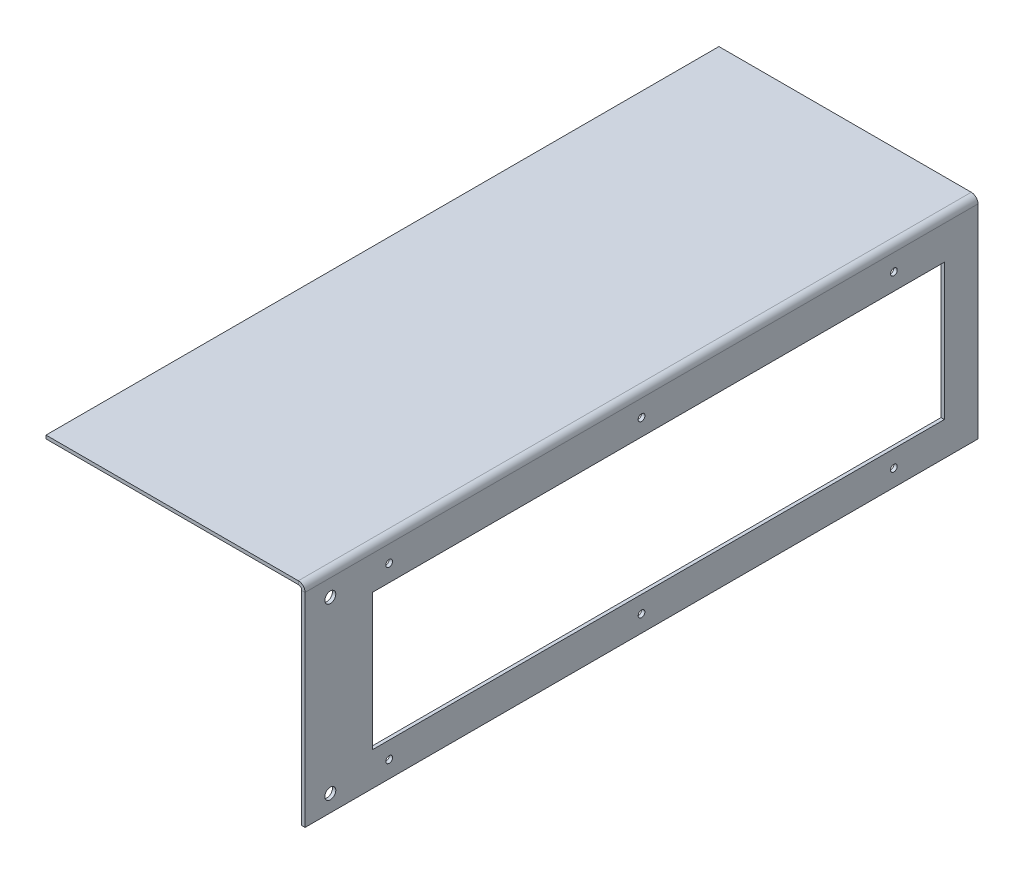
ISO-10303-21;
HEADER;
FILE_DESCRIPTION(('STEP AP214'),'2;1');
FILE_NAME('part.step','',(''),(''),'','','');
FILE_SCHEMA(('AUTOMOTIVE_DESIGN { 1 0 10303 214 1 1 1 1 }'));
ENDSEC;
DATA;
#1=APPLICATION_CONTEXT('core data for automotive mechanical design processes');
#2=APPLICATION_PROTOCOL_DEFINITION('international standard','automotive_design',2000,#1);
#3=PRODUCT_CONTEXT('',#1,'mechanical');
#4=PRODUCT('Part','Part','',(#3));
#5=PRODUCT_RELATED_PRODUCT_CATEGORY('part','',(#4));
#6=PRODUCT_DEFINITION_FORMATION('','',#4);
#7=PRODUCT_DEFINITION_CONTEXT('part definition',#1,'design');
#8=PRODUCT_DEFINITION('design','',#6,#7);
#9=PRODUCT_DEFINITION_SHAPE('','',#8);
#10=(LENGTH_UNIT() NAMED_UNIT(*) SI_UNIT(.MILLI.,.METRE.));
#11=(NAMED_UNIT(*) PLANE_ANGLE_UNIT() SI_UNIT($,.RADIAN.));
#12=(NAMED_UNIT(*) SI_UNIT($,.STERADIAN.) SOLID_ANGLE_UNIT());
#13=UNCERTAINTY_MEASURE_WITH_UNIT(LENGTH_MEASURE(1.E-05),#10,'distance_accuracy_value','');
#14=(GEOMETRIC_REPRESENTATION_CONTEXT(3) GLOBAL_UNCERTAINTY_ASSIGNED_CONTEXT((#13)) GLOBAL_UNIT_ASSIGNED_CONTEXT((#10,
#11,#12)) REPRESENTATION_CONTEXT('',''));
#15=CARTESIAN_POINT('',(0.,0.,0.));
#16=DIRECTION('',(0.,0.,1.));
#17=DIRECTION('',(1.,0.,0.));
#18=AXIS2_PLACEMENT_3D('',#15,#16,#17);
#19=CARTESIAN_POINT('',(79.,-24.0000000000001,360.));
#20=DIRECTION('',(0.,0.,-1.));
#21=DIRECTION('',(0.,-1.,0.));
#22=AXIS2_PLACEMENT_3D('',#19,#20,#21);
#23=PLANE('',#22);
#24=DIRECTION('',(1.,0.,0.));
#25=VECTOR('',#24,1.);
#26=CARTESIAN_POINT('',(79.,-105.,360.));
#27=LINE('',#26,#25);
#28=CARTESIAN_POINT('',(77.,-105.,360.));
#29=VERTEX_POINT('',#28);
#30=CARTESIAN_POINT('',(79.,-105.,360.));
#31=VERTEX_POINT('',#30);
#32=EDGE_CURVE('E11',#29,#31,#27,.T.);
#33=ORIENTED_EDGE('',*,*,#32,.F.);
#34=DIRECTION('',(0.,-1.,0.));
#35=VECTOR('',#34,1.);
#36=CARTESIAN_POINT('',(77.,-4.00000000000001,360.));
#37=LINE('',#36,#35);
#38=CARTESIAN_POINT('',(77.,-24.0000000000001,360.));
#39=VERTEX_POINT('',#38);
#40=EDGE_CURVE('E122',#39,#29,#37,.T.);
#41=ORIENTED_EDGE('',*,*,#40,.F.);
#42=DIRECTION('',(1.,0.,0.));
#43=VECTOR('',#42,1.);
#44=CARTESIAN_POINT('',(79.,-24.0000000000001,360.));
#45=LINE('',#44,#43);
#46=CARTESIAN_POINT('',(79.,-24.0000000000001,360.));
#47=VERTEX_POINT('',#46);
#48=EDGE_CURVE('E49',#39,#47,#45,.T.);
#49=ORIENTED_EDGE('',*,*,#48,.T.);
#50=DIRECTION('',(0.,-1.,0.));
#51=VECTOR('',#50,1.);
#52=CARTESIAN_POINT('',(79.,-24.0000000000001,360.));
#53=LINE('',#52,#51);
#54=EDGE_CURVE('E163',#47,#31,#53,.T.);
#55=ORIENTED_EDGE('',*,*,#54,.T.);
#56=EDGE_LOOP('',(#33,#41,#49,#55));
#57=FACE_BOUND('',#56,.T.);
#58=ADVANCED_FACE('F39',(#57),#23,.T.);
#59=CARTESIAN_POINT('',(79.,-24.,20.));
#60=DIRECTION('',(0.,-1.,0.));
#61=DIRECTION('',(0.,0.,1.));
#62=AXIS2_PLACEMENT_3D('',#59,#60,#61);
#63=PLANE('',#62);
#64=ORIENTED_EDGE('',*,*,#48,.F.);
#65=DIRECTION('',(0.,0.,1.));
#66=VECTOR('',#65,1.);
#67=CARTESIAN_POINT('',(77.,-24.,400.));
#68=LINE('',#67,#66);
#69=CARTESIAN_POINT('',(77.,-24.,20.));
#70=VERTEX_POINT('',#69);
#71=EDGE_CURVE('E133',#70,#39,#68,.T.);
#72=ORIENTED_EDGE('',*,*,#71,.F.);
#73=DIRECTION('',(1.,0.,0.));
#74=VECTOR('',#73,1.);
#75=CARTESIAN_POINT('',(79.,-24.,20.));
#76=LINE('',#75,#74);
#77=CARTESIAN_POINT('',(79.,-24.,20.));
#78=VERTEX_POINT('',#77);
#79=EDGE_CURVE('E113',#70,#78,#76,.T.);
#80=ORIENTED_EDGE('',*,*,#79,.T.);
#81=DIRECTION('',(0.,0.,1.));
#82=VECTOR('',#81,1.);
#83=CARTESIAN_POINT('',(79.,-24.,20.));
#84=LINE('',#83,#82);
#85=EDGE_CURVE('E172',#78,#47,#84,.T.);
#86=ORIENTED_EDGE('',*,*,#85,.T.);
#87=EDGE_LOOP('',(#64,#72,#80,#86));
#88=FACE_BOUND('',#87,.T.);
#89=ADVANCED_FACE('F174',(#88),#63,.T.);
#90=CARTESIAN_POINT('',(79.,-24.,20.));
#91=DIRECTION('',(0.,0.,1.));
#92=DIRECTION('',(0.,1.,0.));
#93=AXIS2_PLACEMENT_3D('',#90,#91,#92);
#94=PLANE('',#93);
#95=ORIENTED_EDGE('',*,*,#79,.F.);
#96=DIRECTION('',(0.,-1.,0.));
#97=VECTOR('',#96,1.);
#98=CARTESIAN_POINT('',(77.,-4.00000000000001,20.));
#99=LINE('',#98,#97);
#100=CARTESIAN_POINT('',(77.,-105.,20.));
#101=VERTEX_POINT('',#100);
#102=EDGE_CURVE('E120',#101,#70,#99,.F.);
#103=ORIENTED_EDGE('',*,*,#102,.F.);
#104=DIRECTION('',(1.,0.,0.));
#105=VECTOR('',#104,1.);
#106=CARTESIAN_POINT('',(79.,-105.,20.));
#107=LINE('',#106,#105);
#108=CARTESIAN_POINT('',(79.,-105.,20.));
#109=VERTEX_POINT('',#108);
#110=EDGE_CURVE('E43',#101,#109,#107,.T.);
#111=ORIENTED_EDGE('',*,*,#110,.T.);
#112=DIRECTION('',(0.,1.,0.));
#113=VECTOR('',#112,1.);
#114=CARTESIAN_POINT('',(79.,-24.,20.));
#115=LINE('',#114,#113);
#116=EDGE_CURVE('E414',#109,#78,#115,.T.);
#117=ORIENTED_EDGE('',*,*,#116,.T.);
#118=EDGE_LOOP('',(#95,#103,#111,#117));
#119=FACE_BOUND('',#118,.T.);
#120=ADVANCED_FACE('F124',(#119),#94,.T.);
#121=CARTESIAN_POINT('',(-75.,0.,400.));
#122=DIRECTION('',(-1.,0.,0.));
#123=DIRECTION('',(0.,0.,-1.));
#124=AXIS2_PLACEMENT_3D('',#121,#122,#123);
#125=PLANE('',#124);
#126=DIRECTION('',(0.,1.,0.));
#127=VECTOR('',#126,1.);
#128=CARTESIAN_POINT('',(-75.,0.,0.));
#129=LINE('',#128,#127);
#130=CARTESIAN_POINT('',(-75.,-1.99999999999999,0.));
#131=VERTEX_POINT('',#130);
#132=CARTESIAN_POINT('',(-75.,0.,0.));
#133=VERTEX_POINT('',#132);
#134=EDGE_CURVE('E114',#131,#133,#129,.T.);
#135=ORIENTED_EDGE('',*,*,#134,.F.);
#136=DIRECTION('',(0.,0.,1.));
#137=VECTOR('',#136,1.);
#138=CARTESIAN_POINT('',(-75.,-1.99999999999999,400.));
#139=LINE('',#138,#137);
#140=CARTESIAN_POINT('',(-75.,-1.99999999999999,400.));
#141=VERTEX_POINT('',#140);
#142=EDGE_CURVE('E218',#141,#131,#139,.F.);
#143=ORIENTED_EDGE('',*,*,#142,.F.);
#144=DIRECTION('',(0.,1.,0.));
#145=VECTOR('',#144,1.);
#146=CARTESIAN_POINT('',(-75.,0.,400.));
#147=LINE('',#146,#145);
#148=CARTESIAN_POINT('',(-75.,0.,400.));
#149=VERTEX_POINT('',#148);
#150=EDGE_CURVE('E150',#141,#149,#147,.T.);
#151=ORIENTED_EDGE('',*,*,#150,.T.);
#152=DIRECTION('',(0.,0.,-1.));
#153=VECTOR('',#152,1.);
#154=CARTESIAN_POINT('',(-75.,0.,400.));
#155=LINE('',#154,#153);
#156=EDGE_CURVE('E385',#149,#133,#155,.T.);
#157=ORIENTED_EDGE('',*,*,#156,.T.);
#158=EDGE_LOOP('',(#135,#143,#151,#157));
#159=FACE_BOUND('',#158,.T.);
#160=ADVANCED_FACE('F268',(#159),#125,.T.);
#161=CARTESIAN_POINT('',(-75.,0.,400.));
#162=DIRECTION('',(0.,0.,1.));
#163=DIRECTION('',(-1.,0.,0.));
#164=AXIS2_PLACEMENT_3D('',#161,#162,#163);
#165=PLANE('',#164);
#166=ORIENTED_EDGE('',*,*,#150,.F.);
#167=DIRECTION('',(1.,0.,0.));
#168=VECTOR('',#167,1.);
#169=CARTESIAN_POINT('',(-75.,-1.99999999999999,400.));
#170=LINE('',#169,#168);
#171=CARTESIAN_POINT('',(75.,-1.99999999999999,400.));
#172=VERTEX_POINT('',#171);
#173=EDGE_CURVE('E198',#172,#141,#170,.F.);
#174=ORIENTED_EDGE('',*,*,#173,.F.);
#175=DIRECTION('',(0.,1.,0.));
#176=VECTOR('',#175,1.);
#177=CARTESIAN_POINT('',(75.,0.,400.));
#178=LINE('',#177,#176);
#179=CARTESIAN_POINT('',(75.,0.,400.));
#180=VERTEX_POINT('',#179);
#181=EDGE_CURVE('E147',#172,#180,#178,.T.);
#182=ORIENTED_EDGE('',*,*,#181,.T.);
#183=DIRECTION('',(-1.,0.,0.));
#184=VECTOR('',#183,1.);
#185=CARTESIAN_POINT('',(-75.,0.,400.));
#186=LINE('',#185,#184);
#187=EDGE_CURVE('E388',#180,#149,#186,.T.);
#188=ORIENTED_EDGE('',*,*,#187,.T.);
#189=EDGE_LOOP('',(#166,#174,#182,#188));
#190=FACE_BOUND('',#189,.T.);
#191=ADVANCED_FACE('F272',(#190),#165,.T.);
#192=CARTESIAN_POINT('',(75.,-4.00000000000001,400.));
#193=DIRECTION('',(0.,0.,-1.));
#194=DIRECTION('',(-1.,0.,0.));
#195=AXIS2_PLACEMENT_3D('',#192,#193,#194);
#196=PLANE('',#195);
#197=ORIENTED_EDGE('',*,*,#181,.F.);
#198=CARTESIAN_POINT('',(75.,-4.00000000000001,400.));
#199=DIRECTION('',(0.,0.,-1.));
#200=DIRECTION('',(-1.,0.,0.));
#201=AXIS2_PLACEMENT_3D('',#198,#199,#200);
#202=CIRCLE('',#201,2.00000000000002);
#203=CARTESIAN_POINT('',(77.,-4.00000000000001,400.));
#204=VERTEX_POINT('',#203);
#205=EDGE_CURVE('E206',#204,#172,#202,.F.);
#206=ORIENTED_EDGE('',*,*,#205,.F.);
#207=DIRECTION('',(1.,0.,0.));
#208=VECTOR('',#207,1.);
#209=CARTESIAN_POINT('',(79.,-4.00000000000001,400.));
#210=LINE('',#209,#208);
#211=CARTESIAN_POINT('',(79.,-4.00000000000001,400.));
#212=VERTEX_POINT('',#211);
#213=EDGE_CURVE('E144',#204,#212,#210,.T.);
#214=ORIENTED_EDGE('',*,*,#213,.T.);
#215=CARTESIAN_POINT('',(75.,-4.00000000000001,400.));
#216=DIRECTION('',(0.,0.,1.));
#217=DIRECTION('',(1.,0.,0.));
#218=AXIS2_PLACEMENT_3D('',#215,#216,#217);
#219=CIRCLE('',#218,4.00000000000002);
#220=EDGE_CURVE('E157',#212,#180,#219,.T.);
#221=ORIENTED_EDGE('',*,*,#220,.T.);
#222=EDGE_LOOP('',(#197,#206,#214,#221));
#223=FACE_BOUND('',#222,.T.);
#224=ADVANCED_FACE('F278',(#223),#196,.F.);
#225=CARTESIAN_POINT('',(79.,-4.00000000000001,400.));
#226=DIRECTION('',(0.,0.,1.));
#227=DIRECTION('',(0.,1.,0.));
#228=AXIS2_PLACEMENT_3D('',#225,#226,#227);
#229=PLANE('',#228);
#230=ORIENTED_EDGE('',*,*,#213,.F.);
#231=DIRECTION('',(0.,-1.,0.));
#232=VECTOR('',#231,1.);
#233=CARTESIAN_POINT('',(77.,-4.00000000000001,400.));
#234=LINE('',#233,#232);
#235=CARTESIAN_POINT('',(77.,-125.,400.));
#236=VERTEX_POINT('',#235);
#237=EDGE_CURVE('E202',#236,#204,#234,.F.);
#238=ORIENTED_EDGE('',*,*,#237,.F.);
#239=DIRECTION('',(1.,0.,0.));
#240=VECTOR('',#239,1.);
#241=CARTESIAN_POINT('',(79.,-125.,400.));
#242=LINE('',#241,#240);
#243=CARTESIAN_POINT('',(79.,-125.,400.));
#244=VERTEX_POINT('',#243);
#245=EDGE_CURVE('E142',#236,#244,#242,.T.);
#246=ORIENTED_EDGE('',*,*,#245,.T.);
#247=DIRECTION('',(0.,1.,0.));
#248=VECTOR('',#247,1.);
#249=CARTESIAN_POINT('',(79.,-4.00000000000001,400.));
#250=LINE('',#249,#248);
#251=EDGE_CURVE('E184',#244,#212,#250,.T.);
#252=ORIENTED_EDGE('',*,*,#251,.T.);
#253=EDGE_LOOP('',(#230,#238,#246,#252));
#254=FACE_BOUND('',#253,.T.);
#255=ADVANCED_FACE('F345',(#254),#229,.T.);
#256=CARTESIAN_POINT('',(79.,-125.,400.));
#257=DIRECTION('',(0.,1.,0.));
#258=DIRECTION('',(0.,0.,-1.));
#259=AXIS2_PLACEMENT_3D('',#256,#257,#258);
#260=PLANE('',#259);
#261=ORIENTED_EDGE('',*,*,#245,.F.);
#262=DIRECTION('',(0.,0.,1.));
#263=VECTOR('',#262,1.);
#264=CARTESIAN_POINT('',(77.,-125.,400.));
#265=LINE('',#264,#263);
#266=CARTESIAN_POINT('',(77.,-125.,0.));
#267=VERTEX_POINT('',#266);
#268=EDGE_CURVE('E207',#236,#267,#265,.F.);
#269=ORIENTED_EDGE('',*,*,#268,.T.);
#270=DIRECTION('',(1.,0.,0.));
#271=VECTOR('',#270,1.);
#272=CARTESIAN_POINT('',(79.,-125.,0.));
#273=LINE('',#272,#271);
#274=CARTESIAN_POINT('',(79.,-125.,0.));
#275=VERTEX_POINT('',#274);
#276=EDGE_CURVE('E57',#267,#275,#273,.T.);
#277=ORIENTED_EDGE('',*,*,#276,.T.);
#278=DIRECTION('',(0.,0.,-1.));
#279=VECTOR('',#278,1.);
#280=CARTESIAN_POINT('',(79.,-125.,400.));
#281=LINE('',#280,#279);
#282=EDGE_CURVE('E187',#244,#275,#281,.T.);
#283=ORIENTED_EDGE('',*,*,#282,.F.);
#284=EDGE_LOOP('',(#261,#269,#277,#283));
#285=FACE_BOUND('',#284,.T.);
#286=ADVANCED_FACE('F341',(#285),#260,.F.);
#287=CARTESIAN_POINT('',(79.,-4.00000000000001,0.));
#288=DIRECTION('',(0.,0.,1.));
#289=DIRECTION('',(0.,1.,0.));
#290=AXIS2_PLACEMENT_3D('',#287,#288,#289);
#291=PLANE('',#290);
#292=ORIENTED_EDGE('',*,*,#276,.F.);
#293=DIRECTION('',(0.,-1.,0.));
#294=VECTOR('',#293,1.);
#295=CARTESIAN_POINT('',(77.,-4.00000000000001,0.));
#296=LINE('',#295,#294);
#297=CARTESIAN_POINT('',(77.,-4.00000000000001,0.));
#298=VERTEX_POINT('',#297);
#299=EDGE_CURVE('E135',#267,#298,#296,.F.);
#300=ORIENTED_EDGE('',*,*,#299,.T.);
#301=DIRECTION('',(1.,0.,0.));
#302=VECTOR('',#301,1.);
#303=CARTESIAN_POINT('',(79.,-4.00000000000001,0.));
#304=LINE('',#303,#302);
#305=CARTESIAN_POINT('',(79.,-4.00000000000001,0.));
#306=VERTEX_POINT('',#305);
#307=EDGE_CURVE('E137',#298,#306,#304,.T.);
#308=ORIENTED_EDGE('',*,*,#307,.T.);
#309=DIRECTION('',(0.,1.,0.));
#310=VECTOR('',#309,1.);
#311=CARTESIAN_POINT('',(79.,-4.00000000000001,0.));
#312=LINE('',#311,#310);
#313=EDGE_CURVE('E175',#275,#306,#312,.T.);
#314=ORIENTED_EDGE('',*,*,#313,.F.);
#315=EDGE_LOOP('',(#292,#300,#308,#314));
#316=FACE_BOUND('',#315,.T.);
#317=ADVANCED_FACE('F337',(#316),#291,.F.);
#318=CARTESIAN_POINT('',(75.,-4.00000000000001,0.));
#319=DIRECTION('',(0.,0.,-1.));
#320=DIRECTION('',(-1.,0.,0.));
#321=AXIS2_PLACEMENT_3D('',#318,#319,#320);
#322=PLANE('',#321);
#323=ORIENTED_EDGE('',*,*,#307,.F.);
#324=CARTESIAN_POINT('',(75.,-4.00000000000001,0.));
#325=DIRECTION('',(0.,0.,-1.));
#326=DIRECTION('',(-1.,0.,0.));
#327=AXIS2_PLACEMENT_3D('',#324,#325,#326);
#328=CIRCLE('',#327,2.00000000000002);
#329=CARTESIAN_POINT('',(75.,-2.,0.));
#330=VERTEX_POINT('',#329);
#331=EDGE_CURVE('E203',#298,#330,#328,.F.);
#332=ORIENTED_EDGE('',*,*,#331,.T.);
#333=DIRECTION('',(0.,1.,0.));
#334=VECTOR('',#333,1.);
#335=CARTESIAN_POINT('',(75.,0.,0.));
#336=LINE('',#335,#334);
#337=CARTESIAN_POINT('',(75.,0.,0.));
#338=VERTEX_POINT('',#337);
#339=EDGE_CURVE('E140',#330,#338,#336,.T.);
#340=ORIENTED_EDGE('',*,*,#339,.T.);
#341=CARTESIAN_POINT('',(75.,-4.00000000000001,0.));
#342=DIRECTION('',(0.,0.,1.));
#343=DIRECTION('',(1.,0.,0.));
#344=AXIS2_PLACEMENT_3D('',#341,#342,#343);
#345=CIRCLE('',#344,4.00000000000002);
#346=EDGE_CURVE('E189',#306,#338,#345,.T.);
#347=ORIENTED_EDGE('',*,*,#346,.F.);
#348=EDGE_LOOP('',(#323,#332,#340,#347));
#349=FACE_BOUND('',#348,.T.);
#350=ADVANCED_FACE('F292',(#349),#322,.T.);
#351=CARTESIAN_POINT('',(79.,-14.,50.));
#352=DIRECTION('',(-1.,0.,0.));
#353=DIRECTION('',(0.,-1.,0.));
#354=AXIS2_PLACEMENT_3D('',#351,#352,#353);
#355=CYLINDRICAL_SURFACE('',#354,2.);
#356=CARTESIAN_POINT('',(79.,-14.,50.));
#357=DIRECTION('',(1.,0.,0.));
#358=DIRECTION('',(0.,-1.,0.));
#359=AXIS2_PLACEMENT_3D('',#356,#357,#358);
#360=CIRCLE('',#359,2.);
#361=CARTESIAN_POINT('',(79.,-16.,50.));
#362=VERTEX_POINT('',#361);
#363=EDGE_CURVE('E393',#362,#362,#360,.T.);
#364=ORIENTED_EDGE('',*,*,#363,.T.);
#365=EDGE_LOOP('',(#364));
#366=FACE_BOUND('',#365,.T.);
#367=CARTESIAN_POINT('',(77.,-14.,50.));
#368=DIRECTION('',(1.,0.,0.));
#369=DIRECTION('',(0.,1.,0.));
#370=AXIS2_PLACEMENT_3D('',#367,#368,#369);
#371=CIRCLE('',#370,2.);
#372=CARTESIAN_POINT('',(77.,-12.,50.));
#373=VERTEX_POINT('',#372);
#374=EDGE_CURVE('E197',#373,#373,#371,.T.);
#375=ORIENTED_EDGE('',*,*,#374,.F.);
#376=EDGE_LOOP('',(#375));
#377=FACE_BOUND('',#376,.T.);
#378=ADVANCED_FACE('F288',(#366,#377),#355,.F.);
#379=CARTESIAN_POINT('',(79.,-14.,200.));
#380=DIRECTION('',(-1.,0.,0.));
#381=DIRECTION('',(0.,-1.,0.));
#382=AXIS2_PLACEMENT_3D('',#379,#380,#381);
#383=CYLINDRICAL_SURFACE('',#382,2.);
#384=CARTESIAN_POINT('',(79.,-14.,200.));
#385=DIRECTION('',(1.,0.,0.));
#386=DIRECTION('',(0.,-1.,0.));
#387=AXIS2_PLACEMENT_3D('',#384,#385,#386);
#388=CIRCLE('',#387,2.);
#389=CARTESIAN_POINT('',(79.,-16.,200.));
#390=VERTEX_POINT('',#389);
#391=EDGE_CURVE('E396',#390,#390,#388,.T.);
#392=ORIENTED_EDGE('',*,*,#391,.T.);
#393=EDGE_LOOP('',(#392));
#394=FACE_BOUND('',#393,.T.);
#395=CARTESIAN_POINT('',(77.,-14.,200.));
#396=DIRECTION('',(1.,0.,0.));
#397=DIRECTION('',(0.,1.,0.));
#398=AXIS2_PLACEMENT_3D('',#395,#396,#397);
#399=CIRCLE('',#398,2.);
#400=CARTESIAN_POINT('',(77.,-12.,200.));
#401=VERTEX_POINT('',#400);
#402=EDGE_CURVE('E226',#401,#401,#399,.T.);
#403=ORIENTED_EDGE('',*,*,#402,.F.);
#404=EDGE_LOOP('',(#403));
#405=FACE_BOUND('',#404,.T.);
#406=ADVANCED_FACE('F291',(#394,#405),#383,.F.);
#407=CARTESIAN_POINT('',(79.,-14.,350.));
#408=DIRECTION('',(-1.,0.,0.));
#409=DIRECTION('',(0.,-1.,0.));
#410=AXIS2_PLACEMENT_3D('',#407,#408,#409);
#411=CYLINDRICAL_SURFACE('',#410,2.);
#412=CARTESIAN_POINT('',(79.,-14.,350.));
#413=DIRECTION('',(1.,0.,0.));
#414=DIRECTION('',(0.,-1.,0.));
#415=AXIS2_PLACEMENT_3D('',#412,#413,#414);
#416=CIRCLE('',#415,2.);
#417=CARTESIAN_POINT('',(79.,-16.,350.));
#418=VERTEX_POINT('',#417);
#419=EDGE_CURVE('E399',#418,#418,#416,.T.);
#420=ORIENTED_EDGE('',*,*,#419,.T.);
#421=EDGE_LOOP('',(#420));
#422=FACE_BOUND('',#421,.T.);
#423=CARTESIAN_POINT('',(77.,-14.,350.));
#424=DIRECTION('',(1.,0.,0.));
#425=DIRECTION('',(0.,1.,0.));
#426=AXIS2_PLACEMENT_3D('',#423,#424,#425);
#427=CIRCLE('',#426,2.);
#428=CARTESIAN_POINT('',(77.,-12.,350.));
#429=VERTEX_POINT('',#428);
#430=EDGE_CURVE('E229',#429,#429,#427,.T.);
#431=ORIENTED_EDGE('',*,*,#430,.F.);
#432=EDGE_LOOP('',(#431));
#433=FACE_BOUND('',#432,.T.);
#434=ADVANCED_FACE('F296',(#422,#433),#411,.F.);
#435=CARTESIAN_POINT('',(79.,-115.,350.));
#436=DIRECTION('',(-1.,0.,0.));
#437=DIRECTION('',(0.,-1.,0.));
#438=AXIS2_PLACEMENT_3D('',#435,#436,#437);
#439=CYLINDRICAL_SURFACE('',#438,2.);
#440=CARTESIAN_POINT('',(79.,-115.,350.));
#441=DIRECTION('',(1.,0.,0.));
#442=DIRECTION('',(0.,1.,0.));
#443=AXIS2_PLACEMENT_3D('',#440,#441,#442);
#444=CIRCLE('',#443,2.);
#445=CARTESIAN_POINT('',(79.,-113.,350.));
#446=VERTEX_POINT('',#445);
#447=EDGE_CURVE('E402',#446,#446,#444,.T.);
#448=ORIENTED_EDGE('',*,*,#447,.T.);
#449=EDGE_LOOP('',(#448));
#450=FACE_BOUND('',#449,.T.);
#451=CARTESIAN_POINT('',(77.,-115.,350.));
#452=DIRECTION('',(1.,0.,0.));
#453=DIRECTION('',(0.,1.,0.));
#454=AXIS2_PLACEMENT_3D('',#451,#452,#453);
#455=CIRCLE('',#454,2.);
#456=CARTESIAN_POINT('',(77.,-113.,350.));
#457=VERTEX_POINT('',#456);
#458=EDGE_CURVE('E232',#457,#457,#455,.T.);
#459=ORIENTED_EDGE('',*,*,#458,.F.);
#460=EDGE_LOOP('',(#459));
#461=FACE_BOUND('',#460,.T.);
#462=ADVANCED_FACE('F300',(#450,#461),#439,.F.);
#463=CARTESIAN_POINT('',(79.,-115.,200.));
#464=DIRECTION('',(-1.,0.,0.));
#465=DIRECTION('',(0.,-1.,0.));
#466=AXIS2_PLACEMENT_3D('',#463,#464,#465);
#467=CYLINDRICAL_SURFACE('',#466,2.);
#468=CARTESIAN_POINT('',(79.,-115.,200.));
#469=DIRECTION('',(1.,0.,0.));
#470=DIRECTION('',(0.,1.,0.));
#471=AXIS2_PLACEMENT_3D('',#468,#469,#470);
#472=CIRCLE('',#471,2.);
#473=CARTESIAN_POINT('',(79.,-113.,200.));
#474=VERTEX_POINT('',#473);
#475=EDGE_CURVE('E312',#474,#474,#472,.T.);
#476=ORIENTED_EDGE('',*,*,#475,.T.);
#477=EDGE_LOOP('',(#476));
#478=FACE_BOUND('',#477,.T.);
#479=CARTESIAN_POINT('',(77.,-115.,200.));
#480=DIRECTION('',(1.,0.,0.));
#481=DIRECTION('',(0.,1.,0.));
#482=AXIS2_PLACEMENT_3D('',#479,#480,#481);
#483=CIRCLE('',#482,2.);
#484=CARTESIAN_POINT('',(77.,-113.,200.));
#485=VERTEX_POINT('',#484);
#486=EDGE_CURVE('E235',#485,#485,#483,.T.);
#487=ORIENTED_EDGE('',*,*,#486,.F.);
#488=EDGE_LOOP('',(#487));
#489=FACE_BOUND('',#488,.T.);
#490=ADVANCED_FACE('F257',(#478,#489),#467,.F.);
#491=CARTESIAN_POINT('',(79.,-115.,50.));
#492=DIRECTION('',(-1.,0.,0.));
#493=DIRECTION('',(0.,-1.,0.));
#494=AXIS2_PLACEMENT_3D('',#491,#492,#493);
#495=CYLINDRICAL_SURFACE('',#494,2.);
#496=CARTESIAN_POINT('',(79.,-115.,50.));
#497=DIRECTION('',(1.,0.,0.));
#498=DIRECTION('',(0.,1.,0.));
#499=AXIS2_PLACEMENT_3D('',#496,#497,#498);
#500=CIRCLE('',#499,2.);
#501=CARTESIAN_POINT('',(79.,-113.,50.));
#502=VERTEX_POINT('',#501);
#503=EDGE_CURVE('E406',#502,#502,#500,.T.);
#504=ORIENTED_EDGE('',*,*,#503,.T.);
#505=EDGE_LOOP('',(#504));
#506=FACE_BOUND('',#505,.T.);
#507=CARTESIAN_POINT('',(77.,-115.,50.));
#508=DIRECTION('',(1.,0.,0.));
#509=DIRECTION('',(0.,1.,0.));
#510=AXIS2_PLACEMENT_3D('',#507,#508,#509);
#511=CIRCLE('',#510,2.);
#512=CARTESIAN_POINT('',(77.,-113.,50.));
#513=VERTEX_POINT('',#512);
#514=EDGE_CURVE('E238',#513,#513,#511,.T.);
#515=ORIENTED_EDGE('',*,*,#514,.F.);
#516=EDGE_LOOP('',(#515));
#517=FACE_BOUND('',#516,.T.);
#518=ADVANCED_FACE('F248',(#506,#517),#495,.F.);
#519=CARTESIAN_POINT('',(79.,-14.,385.));
#520=DIRECTION('',(-1.,0.,0.));
#521=DIRECTION('',(0.,-1.,0.));
#522=AXIS2_PLACEMENT_3D('',#519,#520,#521);
#523=CYLINDRICAL_SURFACE('',#522,3.24999999999995);
#524=CARTESIAN_POINT('',(79.,-14.,385.));
#525=DIRECTION('',(1.,0.,0.));
#526=DIRECTION('',(0.,1.,0.));
#527=AXIS2_PLACEMENT_3D('',#524,#525,#526);
#528=CIRCLE('',#527,3.24999999999995);
#529=CARTESIAN_POINT('',(79.,-10.7500000000001,385.));
#530=VERTEX_POINT('',#529);
#531=EDGE_CURVE('E409',#530,#530,#528,.T.);
#532=ORIENTED_EDGE('',*,*,#531,.T.);
#533=EDGE_LOOP('',(#532));
#534=FACE_BOUND('',#533,.T.);
#535=CARTESIAN_POINT('',(77.,-14.,385.));
#536=DIRECTION('',(1.,0.,0.));
#537=DIRECTION('',(0.,1.,0.));
#538=AXIS2_PLACEMENT_3D('',#535,#536,#537);
#539=CIRCLE('',#538,3.24999999999995);
#540=CARTESIAN_POINT('',(77.,-10.7500000000001,385.));
#541=VERTEX_POINT('',#540);
#542=EDGE_CURVE('E129',#541,#541,#539,.T.);
#543=ORIENTED_EDGE('',*,*,#542,.F.);
#544=EDGE_LOOP('',(#543));
#545=FACE_BOUND('',#544,.T.);
#546=ADVANCED_FACE('F245',(#534,#545),#523,.F.);
#547=CARTESIAN_POINT('',(79.,-115.,385.));
#548=DIRECTION('',(-1.,0.,0.));
#549=DIRECTION('',(0.,-1.,0.));
#550=AXIS2_PLACEMENT_3D('',#547,#548,#549);
#551=CYLINDRICAL_SURFACE('',#550,3.24999999999995);
#552=CARTESIAN_POINT('',(79.,-115.,385.));
#553=DIRECTION('',(1.,0.,0.));
#554=DIRECTION('',(0.,1.,0.));
#555=AXIS2_PLACEMENT_3D('',#552,#553,#554);
#556=CIRCLE('',#555,3.24999999999995);
#557=CARTESIAN_POINT('',(79.,-111.75,385.));
#558=VERTEX_POINT('',#557);
#559=EDGE_CURVE('E411',#558,#558,#556,.T.);
#560=ORIENTED_EDGE('',*,*,#559,.T.);
#561=EDGE_LOOP('',(#560));
#562=FACE_BOUND('',#561,.T.);
#563=CARTESIAN_POINT('',(77.,-115.,385.));
#564=DIRECTION('',(1.,0.,0.));
#565=DIRECTION('',(0.,1.,0.));
#566=AXIS2_PLACEMENT_3D('',#563,#564,#565);
#567=CIRCLE('',#566,3.24999999999995);
#568=CARTESIAN_POINT('',(77.,-111.75,385.));
#569=VERTEX_POINT('',#568);
#570=EDGE_CURVE('E126',#569,#569,#567,.T.);
#571=ORIENTED_EDGE('',*,*,#570,.F.);
#572=EDGE_LOOP('',(#571));
#573=FACE_BOUND('',#572,.T.);
#574=ADVANCED_FACE('F247',(#562,#573),#551,.F.);
#575=CARTESIAN_POINT('',(79.,-105.,360.));
#576=DIRECTION('',(0.,1.,0.));
#577=DIRECTION('',(0.,0.,-1.));
#578=AXIS2_PLACEMENT_3D('',#575,#576,#577);
#579=PLANE('',#578);
#580=DIRECTION('',(0.,0.,1.));
#581=VECTOR('',#580,1.);
#582=CARTESIAN_POINT('',(77.,-105.,400.));
#583=LINE('',#582,#581);
#584=EDGE_CURVE('E105',#29,#101,#583,.F.);
#585=ORIENTED_EDGE('',*,*,#584,.F.);
#586=ORIENTED_EDGE('',*,*,#32,.T.);
#587=DIRECTION('',(0.,0.,-1.));
#588=VECTOR('',#587,1.);
#589=CARTESIAN_POINT('',(79.,-105.,360.));
#590=LINE('',#589,#588);
#591=EDGE_CURVE('E108',#31,#109,#590,.T.);
#592=ORIENTED_EDGE('',*,*,#591,.T.);
#593=ORIENTED_EDGE('',*,*,#110,.F.);
#594=EDGE_LOOP('',(#585,#586,#592,#593));
#595=FACE_BOUND('',#594,.T.);
#596=ADVANCED_FACE('F41',(#595),#579,.T.);
#597=CARTESIAN_POINT('',(-75.,0.,0.));
#598=DIRECTION('',(0.,0.,1.));
#599=DIRECTION('',(-1.,0.,0.));
#600=AXIS2_PLACEMENT_3D('',#597,#598,#599);
#601=PLANE('',#600);
#602=DIRECTION('',(1.,0.,0.));
#603=VECTOR('',#602,1.);
#604=CARTESIAN_POINT('',(-75.,-1.99999999999999,0.));
#605=LINE('',#604,#603);
#606=EDGE_CURVE('E221',#330,#131,#605,.F.);
#607=ORIENTED_EDGE('',*,*,#606,.T.);
#608=ORIENTED_EDGE('',*,*,#134,.T.);
#609=DIRECTION('',(-1.,0.,0.));
#610=VECTOR('',#609,1.);
#611=CARTESIAN_POINT('',(-75.,0.,0.));
#612=LINE('',#611,#610);
#613=EDGE_CURVE('E215',#338,#133,#612,.T.);
#614=ORIENTED_EDGE('',*,*,#613,.F.);
#615=ORIENTED_EDGE('',*,*,#339,.F.);
#616=EDGE_LOOP('',(#607,#608,#614,#615));
#617=FACE_BOUND('',#616,.T.);
#618=ADVANCED_FACE('F283',(#617),#601,.F.);
#619=CARTESIAN_POINT('',(75.,-4.00000000000001,400.));
#620=DIRECTION('',(0.,0.,-1.));
#621=DIRECTION('',(-1.,0.,0.));
#622=AXIS2_PLACEMENT_3D('',#619,#620,#621);
#623=CYLINDRICAL_SURFACE('',#622,4.00000000000002);
#624=ORIENTED_EDGE('',*,*,#346,.T.);
#625=DIRECTION('',(0.,0.,-1.));
#626=VECTOR('',#625,1.);
#627=CARTESIAN_POINT('',(75.,0.,400.));
#628=LINE('',#627,#626);
#629=EDGE_CURVE('E386',#180,#338,#628,.T.);
#630=ORIENTED_EDGE('',*,*,#629,.F.);
#631=ORIENTED_EDGE('',*,*,#220,.F.);
#632=DIRECTION('',(0.,0.,-1.));
#633=VECTOR('',#632,1.);
#634=CARTESIAN_POINT('',(79.,-4.00000000000001,400.));
#635=LINE('',#634,#633);
#636=EDGE_CURVE('E178',#212,#306,#635,.T.);
#637=ORIENTED_EDGE('',*,*,#636,.T.);
#638=EDGE_LOOP('',(#624,#630,#631,#637));
#639=FACE_BOUND('',#638,.T.);
#640=ADVANCED_FACE('F286',(#639),#623,.T.);
#641=CARTESIAN_POINT('',(79.,-4.00000000000001,400.));
#642=DIRECTION('',(-1.,0.,0.));
#643=DIRECTION('',(0.,-1.,0.));
#644=AXIS2_PLACEMENT_3D('',#641,#642,#643);
#645=PLANE('',#644);
#646=ORIENTED_EDGE('',*,*,#363,.F.);
#647=EDGE_LOOP('',(#646));
#648=FACE_BOUND('',#647,.T.);
#649=ORIENTED_EDGE('',*,*,#391,.F.);
#650=EDGE_LOOP('',(#649));
#651=FACE_BOUND('',#650,.T.);
#652=ORIENTED_EDGE('',*,*,#419,.F.);
#653=EDGE_LOOP('',(#652));
#654=FACE_BOUND('',#653,.T.);
#655=ORIENTED_EDGE('',*,*,#447,.F.);
#656=EDGE_LOOP('',(#655));
#657=FACE_BOUND('',#656,.T.);
#658=ORIENTED_EDGE('',*,*,#475,.F.);
#659=EDGE_LOOP('',(#658));
#660=FACE_BOUND('',#659,.T.);
#661=ORIENTED_EDGE('',*,*,#503,.F.);
#662=EDGE_LOOP('',(#661));
#663=FACE_BOUND('',#662,.T.);
#664=ORIENTED_EDGE('',*,*,#531,.F.);
#665=EDGE_LOOP('',(#664));
#666=FACE_BOUND('',#665,.T.);
#667=ORIENTED_EDGE('',*,*,#559,.F.);
#668=EDGE_LOOP('',(#667));
#669=FACE_BOUND('',#668,.T.);
#670=ORIENTED_EDGE('',*,*,#116,.F.);
#671=ORIENTED_EDGE('',*,*,#591,.F.);
#672=ORIENTED_EDGE('',*,*,#54,.F.);
#673=ORIENTED_EDGE('',*,*,#85,.F.);
#674=EDGE_LOOP('',(#670,#671,#672,#673));
#675=FACE_BOUND('',#674,.T.);
#676=ORIENTED_EDGE('',*,*,#313,.T.);
#677=ORIENTED_EDGE('',*,*,#636,.F.);
#678=ORIENTED_EDGE('',*,*,#251,.F.);
#679=ORIENTED_EDGE('',*,*,#282,.T.);
#680=EDGE_LOOP('',(#676,#677,#678,#679));
#681=FACE_BOUND('',#680,.T.);
#682=ADVANCED_FACE('F170',(#648,#651,#654,#657,#660,#663,#666,#669,#675,#681),#645,.F.);
#683=CARTESIAN_POINT('',(-75.,0.,400.));
#684=DIRECTION('',(0.,-1.,0.));
#685=DIRECTION('',(1.,0.,0.));
#686=AXIS2_PLACEMENT_3D('',#683,#684,#685);
#687=PLANE('',#686);
#688=ORIENTED_EDGE('',*,*,#613,.T.);
#689=ORIENTED_EDGE('',*,*,#156,.F.);
#690=ORIENTED_EDGE('',*,*,#187,.F.);
#691=ORIENTED_EDGE('',*,*,#629,.T.);
#692=EDGE_LOOP('',(#688,#689,#690,#691));
#693=FACE_BOUND('',#692,.T.);
#694=ADVANCED_FACE('F329',(#693),#687,.F.);
#695=CARTESIAN_POINT('',(75.,-4.00000000000001,400.));
#696=DIRECTION('',(0.,0.,-1.));
#697=DIRECTION('',(-1.,0.,0.));
#698=AXIS2_PLACEMENT_3D('',#695,#696,#697);
#699=CYLINDRICAL_SURFACE('',#698,2.00000000000002);
#700=ORIENTED_EDGE('',*,*,#331,.F.);
#701=DIRECTION('',(0.,0.,-1.));
#702=VECTOR('',#701,1.);
#703=CARTESIAN_POINT('',(77.,-4.00000000000001,400.));
#704=LINE('',#703,#702);
#705=EDGE_CURVE('E199',#204,#298,#704,.T.);
#706=ORIENTED_EDGE('',*,*,#705,.F.);
#707=ORIENTED_EDGE('',*,*,#205,.T.);
#708=DIRECTION('',(0.,0.,1.));
#709=VECTOR('',#708,1.);
#710=CARTESIAN_POINT('',(75.,-1.99999999999999,400.));
#711=LINE('',#710,#709);
#712=EDGE_CURVE('E194',#172,#330,#711,.F.);
#713=ORIENTED_EDGE('',*,*,#712,.T.);
#714=EDGE_LOOP('',(#700,#706,#707,#713));
#715=FACE_BOUND('',#714,.T.);
#716=ADVANCED_FACE('F318',(#715),#699,.F.);
#717=CARTESIAN_POINT('',(77.,-4.00000000000001,400.));
#718=DIRECTION('',(-1.,0.,0.));
#719=DIRECTION('',(0.,-1.,0.));
#720=AXIS2_PLACEMENT_3D('',#717,#718,#719);
#721=PLANE('',#720);
#722=ORIENTED_EDGE('',*,*,#374,.T.);
#723=EDGE_LOOP('',(#722));
#724=FACE_BOUND('',#723,.T.);
#725=ORIENTED_EDGE('',*,*,#402,.T.);
#726=EDGE_LOOP('',(#725));
#727=FACE_BOUND('',#726,.T.);
#728=ORIENTED_EDGE('',*,*,#430,.T.);
#729=EDGE_LOOP('',(#728));
#730=FACE_BOUND('',#729,.T.);
#731=ORIENTED_EDGE('',*,*,#458,.T.);
#732=EDGE_LOOP('',(#731));
#733=FACE_BOUND('',#732,.T.);
#734=ORIENTED_EDGE('',*,*,#486,.T.);
#735=EDGE_LOOP('',(#734));
#736=FACE_BOUND('',#735,.T.);
#737=ORIENTED_EDGE('',*,*,#514,.T.);
#738=EDGE_LOOP('',(#737));
#739=FACE_BOUND('',#738,.T.);
#740=ORIENTED_EDGE('',*,*,#542,.T.);
#741=EDGE_LOOP('',(#740));
#742=FACE_BOUND('',#741,.T.);
#743=ORIENTED_EDGE('',*,*,#570,.T.);
#744=EDGE_LOOP('',(#743));
#745=FACE_BOUND('',#744,.T.);
#746=ORIENTED_EDGE('',*,*,#102,.T.);
#747=ORIENTED_EDGE('',*,*,#71,.T.);
#748=ORIENTED_EDGE('',*,*,#40,.T.);
#749=ORIENTED_EDGE('',*,*,#584,.T.);
#750=EDGE_LOOP('',(#746,#747,#748,#749));
#751=FACE_BOUND('',#750,.T.);
#752=ORIENTED_EDGE('',*,*,#299,.F.);
#753=ORIENTED_EDGE('',*,*,#268,.F.);
#754=ORIENTED_EDGE('',*,*,#237,.T.);
#755=ORIENTED_EDGE('',*,*,#705,.T.);
#756=EDGE_LOOP('',(#752,#753,#754,#755));
#757=FACE_BOUND('',#756,.T.);
#758=ADVANCED_FACE('F117',(#724,#727,#730,#733,#736,#739,#742,#745,#751,#757),#721,.T.);
#759=CARTESIAN_POINT('',(-75.,-1.99999999999999,400.));
#760=DIRECTION('',(0.,-1.,0.));
#761=DIRECTION('',(1.,0.,0.));
#762=AXIS2_PLACEMENT_3D('',#759,#760,#761);
#763=PLANE('',#762);
#764=ORIENTED_EDGE('',*,*,#606,.F.);
#765=ORIENTED_EDGE('',*,*,#712,.F.);
#766=ORIENTED_EDGE('',*,*,#173,.T.);
#767=ORIENTED_EDGE('',*,*,#142,.T.);
#768=EDGE_LOOP('',(#764,#765,#766,#767));
#769=FACE_BOUND('',#768,.T.);
#770=ADVANCED_FACE('F317',(#769),#763,.T.);
#771=CLOSED_SHELL('',(#58,#89,#120,#160,#191,#224,#255,#286,#317,#350,#378,#406,#434,#462,#490,
#518,#546,#574,#596,#618,#640,#682,#694,#716,#758,#770));
#772=MANIFOLD_SOLID_BREP('B2',#771);
#773=ADVANCED_BREP_SHAPE_REPRESENTATION('',(#18,#772),#14);
#774=SHAPE_DEFINITION_REPRESENTATION(#9,#773);
ENDSEC;
END-ISO-10303-21;
